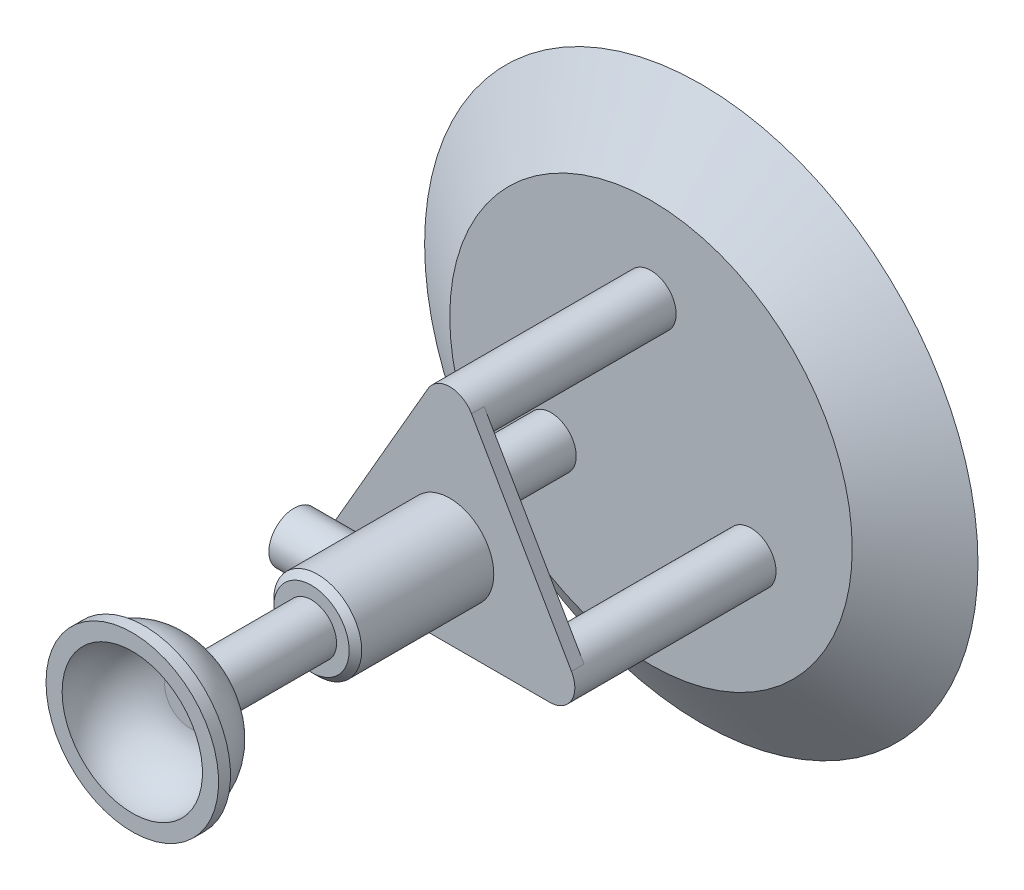
ISO-10303-21;
HEADER;
FILE_DESCRIPTION(('STEP AP214'),'2;1');
FILE_NAME('part.step','',(''),(''),'','','');
FILE_SCHEMA(('AUTOMOTIVE_DESIGN { 1 0 10303 214 1 1 1 1 }'));
ENDSEC;
DATA;
#1=APPLICATION_CONTEXT('core data for automotive mechanical design processes');
#2=APPLICATION_PROTOCOL_DEFINITION('international standard','automotive_design',2000,#1);
#3=PRODUCT_CONTEXT('',#1,'mechanical');
#4=PRODUCT('Part','Part','',(#3));
#5=PRODUCT_RELATED_PRODUCT_CATEGORY('part','',(#4));
#6=PRODUCT_DEFINITION_FORMATION('','',#4);
#7=PRODUCT_DEFINITION_CONTEXT('part definition',#1,'design');
#8=PRODUCT_DEFINITION('design','',#6,#7);
#9=PRODUCT_DEFINITION_SHAPE('','',#8);
#10=(LENGTH_UNIT() NAMED_UNIT(*) SI_UNIT(.MILLI.,.METRE.));
#11=(NAMED_UNIT(*) PLANE_ANGLE_UNIT() SI_UNIT($,.RADIAN.));
#12=(NAMED_UNIT(*) SI_UNIT($,.STERADIAN.) SOLID_ANGLE_UNIT());
#13=UNCERTAINTY_MEASURE_WITH_UNIT(LENGTH_MEASURE(1.E-05),#10,'distance_accuracy_value','');
#14=(GEOMETRIC_REPRESENTATION_CONTEXT(3) GLOBAL_UNCERTAINTY_ASSIGNED_CONTEXT((#13)) GLOBAL_UNIT_ASSIGNED_CONTEXT((#10,
#11,#12)) REPRESENTATION_CONTEXT('',''));
#15=CARTESIAN_POINT('',(0.,0.,0.));
#16=DIRECTION('',(0.,0.,1.));
#17=DIRECTION('',(1.,0.,0.));
#18=AXIS2_PLACEMENT_3D('',#15,#16,#17);
#19=CARTESIAN_POINT('',(0.,0.,0.));
#20=DIRECTION('',(0.,0.,1.));
#21=DIRECTION('',(1.,0.,0.));
#22=AXIS2_PLACEMENT_3D('',#19,#20,#21);
#23=PLANE('',#22);
#24=CARTESIAN_POINT('',(0.,0.,0.));
#25=DIRECTION('',(0.,0.,1.));
#26=DIRECTION('',(1.,0.,0.));
#27=AXIS2_PLACEMENT_3D('',#24,#25,#26);
#28=CIRCLE('',#27,22.);
#29=CARTESIAN_POINT('',(22.,0.,0.));
#30=VERTEX_POINT('',#29);
#31=EDGE_CURVE('E134',#30,#30,#28,.T.);
#32=ORIENTED_EDGE('',*,*,#31,.F.);
#33=EDGE_LOOP('',(#32));
#34=FACE_BOUND('',#33,.T.);
#35=ADVANCED_FACE('F41',(#34),#23,.F.);
#36=CARTESIAN_POINT('',(0.,0.,0.));
#37=DIRECTION('',(0.,0.,-1.));
#38=DIRECTION('',(-1.,0.,0.));
#39=AXIS2_PLACEMENT_3D('',#36,#37,#38);
#40=CONICAL_SURFACE('',#39,22.,0.982793723247328);
#41=CARTESIAN_POINT('',(0.,0.,4.));
#42=DIRECTION('',(0.,0.,1.));
#43=DIRECTION('',(1.,0.,0.));
#44=AXIS2_PLACEMENT_3D('',#41,#42,#43);
#45=CIRCLE('',#44,16.);
#46=CARTESIAN_POINT('',(16.,0.,4.));
#47=VERTEX_POINT('',#46);
#48=EDGE_CURVE('E131',#47,#47,#45,.T.);
#49=ORIENTED_EDGE('',*,*,#48,.F.);
#50=EDGE_LOOP('',(#49));
#51=FACE_BOUND('',#50,.T.);
#52=ORIENTED_EDGE('',*,*,#31,.T.);
#53=EDGE_LOOP('',(#52));
#54=FACE_BOUND('',#53,.T.);
#55=ADVANCED_FACE('F209',(#51,#54),#40,.T.);
#56=CARTESIAN_POINT('',(0.,16.,4.));
#57=DIRECTION('',(0.,0.,-1.));
#58=DIRECTION('',(-1.,0.,0.));
#59=AXIS2_PLACEMENT_3D('',#56,#57,#58);
#60=PLANE('',#59);
#61=CARTESIAN_POINT('',(0.,9.17346790913956,4.));
#62=DIRECTION('',(0.,0.,-1.));
#63=DIRECTION('',(-1.,0.,0.));
#64=AXIS2_PLACEMENT_3D('',#61,#62,#63);
#65=CIRCLE('',#64,2.);
#66=CARTESIAN_POINT('',(-2.,9.17346790913956,4.));
#67=VERTEX_POINT('',#66);
#68=EDGE_CURVE('E143',#67,#67,#65,.F.);
#69=ORIENTED_EDGE('',*,*,#68,.F.);
#70=EDGE_LOOP('',(#69));
#71=FACE_BOUND('',#70,.T.);
#72=CARTESIAN_POINT('',(-7.94445625011618,-4.58673395456978,4.));
#73=DIRECTION('',(0.,0.,-1.));
#74=DIRECTION('',(-1.,0.,0.));
#75=AXIS2_PLACEMENT_3D('',#72,#73,#74);
#76=CIRCLE('',#75,2.);
#77=CARTESIAN_POINT('',(-9.94445625011618,-4.58673395456978,4.));
#78=VERTEX_POINT('',#77);
#79=EDGE_CURVE('E140',#78,#78,#76,.F.);
#80=ORIENTED_EDGE('',*,*,#79,.F.);
#81=EDGE_LOOP('',(#80));
#82=FACE_BOUND('',#81,.T.);
#83=CARTESIAN_POINT('',(7.94445625011617,-4.58673395456978,4.));
#84=DIRECTION('',(0.,0.,-1.));
#85=DIRECTION('',(-1.,0.,0.));
#86=AXIS2_PLACEMENT_3D('',#83,#84,#85);
#87=CIRCLE('',#86,2.);
#88=CARTESIAN_POINT('',(5.94445625011617,-4.58673395456978,4.));
#89=VERTEX_POINT('',#88);
#90=EDGE_CURVE('E137',#89,#89,#87,.F.);
#91=ORIENTED_EDGE('',*,*,#90,.F.);
#92=EDGE_LOOP('',(#91));
#93=FACE_BOUND('',#92,.T.);
#94=ORIENTED_EDGE('',*,*,#48,.T.);
#95=EDGE_LOOP('',(#94));
#96=FACE_BOUND('',#95,.T.);
#97=ADVANCED_FACE('F214',(#71,#82,#93,#96),#60,.F.);
#98=CARTESIAN_POINT('',(7.94445625011617,-4.58673395456978,19.));
#99=DIRECTION('',(0.,0.,-1.));
#100=DIRECTION('',(-1.,0.,0.));
#101=AXIS2_PLACEMENT_3D('',#98,#99,#100);
#102=CYLINDRICAL_SURFACE('',#101,2.);
#103=CARTESIAN_POINT('',(7.94445625011617,-4.58673395456978,19.));
#104=DIRECTION('',(0.,0.,1.));
#105=DIRECTION('',(1.,0.,0.));
#106=AXIS2_PLACEMENT_3D('',#103,#104,#105);
#107=CIRCLE('',#106,2.);
#108=CARTESIAN_POINT('',(9.67650705768505,-3.58673395456978,19.));
#109=VERTEX_POINT('',#108);
#110=CARTESIAN_POINT('',(7.94445625011617,-6.58673395456978,19.));
#111=VERTEX_POINT('',#110);
#112=EDGE_CURVE('E63',#109,#111,#107,.T.);
#113=ORIENTED_EDGE('',*,*,#112,.F.);
#114=DIRECTION('',(0.,0.,-1.));
#115=VECTOR('',#114,1.);
#116=CARTESIAN_POINT('',(9.67650705768505,-3.58673395456978,20.));
#117=LINE('',#116,#115);
#118=CARTESIAN_POINT('',(9.67650705768505,-3.58673395456978,20.));
#119=VERTEX_POINT('',#118);
#120=EDGE_CURVE('E125',#119,#109,#117,.T.);
#121=ORIENTED_EDGE('',*,*,#120,.F.);
#122=CARTESIAN_POINT('',(7.94445625011617,-4.58673395456978,20.));
#123=DIRECTION('',(0.,0.,1.));
#124=DIRECTION('',(1.,0.,0.));
#125=AXIS2_PLACEMENT_3D('',#122,#123,#124);
#126=CIRCLE('',#125,2.);
#127=CARTESIAN_POINT('',(7.94445625011617,-6.58673395456978,20.));
#128=VERTEX_POINT('',#127);
#129=EDGE_CURVE('E110',#128,#119,#126,.T.);
#130=ORIENTED_EDGE('',*,*,#129,.F.);
#131=DIRECTION('',(0.,0.,-1.));
#132=VECTOR('',#131,1.);
#133=CARTESIAN_POINT('',(7.94445625011617,-6.58673395456978,20.));
#134=LINE('',#133,#132);
#135=EDGE_CURVE('E107',#128,#111,#134,.T.);
#136=ORIENTED_EDGE('',*,*,#135,.T.);
#137=EDGE_LOOP('',(#113,#121,#130,#136));
#138=FACE_BOUND('',#137,.T.);
#139=ORIENTED_EDGE('',*,*,#90,.T.);
#140=EDGE_LOOP('',(#139));
#141=FACE_BOUND('',#140,.T.);
#142=ADVANCED_FACE('F221',(#138,#141),#102,.T.);
#143=CARTESIAN_POINT('',(-7.94445625011618,-4.58673395456978,19.));
#144=DIRECTION('',(0.,0.,-1.));
#145=DIRECTION('',(-1.,0.,0.));
#146=AXIS2_PLACEMENT_3D('',#143,#144,#145);
#147=CYLINDRICAL_SURFACE('',#146,2.);
#148=CARTESIAN_POINT('',(-7.94445625011618,-4.58673395456978,19.));
#149=DIRECTION('',(0.,0.,1.));
#150=DIRECTION('',(1.,0.,0.));
#151=AXIS2_PLACEMENT_3D('',#148,#149,#150);
#152=CIRCLE('',#151,2.);
#153=CARTESIAN_POINT('',(-7.94445625011618,-6.58673395456978,19.));
#154=VERTEX_POINT('',#153);
#155=CARTESIAN_POINT('',(-9.67650705768505,-3.58673395456978,19.));
#156=VERTEX_POINT('',#155);
#157=EDGE_CURVE('E71',#154,#156,#152,.T.);
#158=ORIENTED_EDGE('',*,*,#157,.F.);
#159=DIRECTION('',(0.,0.,-1.));
#160=VECTOR('',#159,1.);
#161=CARTESIAN_POINT('',(-7.94445625011618,-6.58673395456978,20.));
#162=LINE('',#161,#160);
#163=CARTESIAN_POINT('',(-7.94445625011618,-6.58673395456978,20.));
#164=VERTEX_POINT('',#163);
#165=EDGE_CURVE('E105',#164,#154,#162,.T.);
#166=ORIENTED_EDGE('',*,*,#165,.F.);
#167=CARTESIAN_POINT('',(-7.94445625011618,-4.58673395456978,20.));
#168=DIRECTION('',(0.,0.,1.));
#169=DIRECTION('',(1.,0.,0.));
#170=AXIS2_PLACEMENT_3D('',#167,#168,#169);
#171=CIRCLE('',#170,2.);
#172=CARTESIAN_POINT('',(-9.67650705768505,-3.58673395456978,20.));
#173=VERTEX_POINT('',#172);
#174=EDGE_CURVE('E111',#173,#164,#171,.T.);
#175=ORIENTED_EDGE('',*,*,#174,.F.);
#176=DIRECTION('',(0.,0.,-1.));
#177=VECTOR('',#176,1.);
#178=CARTESIAN_POINT('',(-9.67650705768505,-3.58673395456978,20.));
#179=LINE('',#178,#177);
#180=EDGE_CURVE('E168',#173,#156,#179,.T.);
#181=ORIENTED_EDGE('',*,*,#180,.T.);
#182=EDGE_LOOP('',(#158,#166,#175,#181));
#183=FACE_BOUND('',#182,.T.);
#184=ORIENTED_EDGE('',*,*,#79,.T.);
#185=EDGE_LOOP('',(#184));
#186=FACE_BOUND('',#185,.T.);
#187=ADVANCED_FACE('F120',(#183,#186),#147,.T.);
#188=CARTESIAN_POINT('',(0.,9.17346790913956,19.));
#189=DIRECTION('',(0.,0.,-1.));
#190=DIRECTION('',(-1.,0.,0.));
#191=AXIS2_PLACEMENT_3D('',#188,#189,#190);
#192=CYLINDRICAL_SURFACE('',#191,2.);
#193=CARTESIAN_POINT('',(0.,9.17346790913956,19.));
#194=DIRECTION('',(0.,0.,1.));
#195=DIRECTION('',(1.,0.,0.));
#196=AXIS2_PLACEMENT_3D('',#193,#194,#195);
#197=CIRCLE('',#196,2.);
#198=CARTESIAN_POINT('',(-1.73205080756888,10.1734679091396,19.));
#199=VERTEX_POINT('',#198);
#200=CARTESIAN_POINT('',(1.73205080756888,10.1734679091396,19.));
#201=VERTEX_POINT('',#200);
#202=EDGE_CURVE('E123',#199,#201,#197,.T.);
#203=ORIENTED_EDGE('',*,*,#202,.F.);
#204=DIRECTION('',(0.,0.,-1.));
#205=VECTOR('',#204,1.);
#206=CARTESIAN_POINT('',(-1.73205080756888,10.1734679091396,20.));
#207=LINE('',#206,#205);
#208=CARTESIAN_POINT('',(-1.73205080756888,10.1734679091396,20.));
#209=VERTEX_POINT('',#208);
#210=EDGE_CURVE('E176',#209,#199,#207,.T.);
#211=ORIENTED_EDGE('',*,*,#210,.F.);
#212=CARTESIAN_POINT('',(0.,9.17346790913956,20.));
#213=DIRECTION('',(0.,0.,1.));
#214=DIRECTION('',(1.,0.,0.));
#215=AXIS2_PLACEMENT_3D('',#212,#213,#214);
#216=CIRCLE('',#215,2.);
#217=CARTESIAN_POINT('',(1.73205080756888,10.1734679091396,20.));
#218=VERTEX_POINT('',#217);
#219=EDGE_CURVE('E165',#218,#209,#216,.T.);
#220=ORIENTED_EDGE('',*,*,#219,.F.);
#221=DIRECTION('',(0.,0.,-1.));
#222=VECTOR('',#221,1.);
#223=CARTESIAN_POINT('',(1.73205080756888,10.1734679091396,20.));
#224=LINE('',#223,#222);
#225=EDGE_CURVE('E179',#218,#201,#224,.T.);
#226=ORIENTED_EDGE('',*,*,#225,.T.);
#227=EDGE_LOOP('',(#203,#211,#220,#226));
#228=FACE_BOUND('',#227,.T.);
#229=ORIENTED_EDGE('',*,*,#68,.T.);
#230=EDGE_LOOP('',(#229));
#231=FACE_BOUND('',#230,.T.);
#232=ADVANCED_FACE('F192',(#228,#231),#192,.T.);
#233=CARTESIAN_POINT('',(-7.94445625011618,-4.58673395456978,19.));
#234=DIRECTION('',(0.,0.,1.));
#235=DIRECTION('',(1.,0.,0.));
#236=AXIS2_PLACEMENT_3D('',#233,#234,#235);
#237=PLANE('',#236);
#238=DIRECTION('',(-0.5,0.866025403784439,0.));
#239=VECTOR('',#238,1.);
#240=CARTESIAN_POINT('',(1.73205080756888,10.1734679091396,19.));
#241=LINE('',#240,#239);
#242=EDGE_CURVE('E170',#109,#201,#241,.T.);
#243=ORIENTED_EDGE('',*,*,#242,.F.);
#244=ORIENTED_EDGE('',*,*,#112,.T.);
#245=DIRECTION('',(1.,0.,0.));
#246=VECTOR('',#245,1.);
#247=CARTESIAN_POINT('',(7.94445625011617,-6.58673395456978,19.));
#248=LINE('',#247,#246);
#249=EDGE_CURVE('E160',#154,#111,#248,.T.);
#250=ORIENTED_EDGE('',*,*,#249,.F.);
#251=ORIENTED_EDGE('',*,*,#157,.T.);
#252=DIRECTION('',(-0.5,-0.866025403784438,0.));
#253=VECTOR('',#252,1.);
#254=CARTESIAN_POINT('',(-1.73205080756888,10.1734679091396,19.));
#255=LINE('',#254,#253);
#256=EDGE_CURVE('E118',#199,#156,#255,.T.);
#257=ORIENTED_EDGE('',*,*,#256,.F.);
#258=ORIENTED_EDGE('',*,*,#202,.T.);
#259=EDGE_LOOP('',(#243,#244,#250,#251,#257,#258));
#260=FACE_BOUND('',#259,.T.);
#261=ADVANCED_FACE('F188',(#260),#237,.F.);
#262=CARTESIAN_POINT('',(7.94445625011617,-6.58673395456978,20.));
#263=DIRECTION('',(0.,1.,0.));
#264=DIRECTION('',(-1.,0.,0.));
#265=AXIS2_PLACEMENT_3D('',#262,#263,#264);
#266=PLANE('',#265);
#267=ORIENTED_EDGE('',*,*,#249,.T.);
#268=ORIENTED_EDGE('',*,*,#135,.F.);
#269=DIRECTION('',(1.,0.,0.));
#270=VECTOR('',#269,1.);
#271=CARTESIAN_POINT('',(7.94445625011617,-6.58673395456978,20.));
#272=LINE('',#271,#270);
#273=EDGE_CURVE('E102',#164,#128,#272,.T.);
#274=ORIENTED_EDGE('',*,*,#273,.F.);
#275=ORIENTED_EDGE('',*,*,#165,.T.);
#276=EDGE_LOOP('',(#267,#268,#274,#275));
#277=FACE_BOUND('',#276,.T.);
#278=ADVANCED_FACE('F104',(#277),#266,.F.);
#279=CARTESIAN_POINT('',(1.73205080756888,10.1734679091396,20.));
#280=DIRECTION('',(-0.866025403784439,-0.5,0.));
#281=DIRECTION('',(0.5,-0.866025403784439,0.));
#282=AXIS2_PLACEMENT_3D('',#279,#280,#281);
#283=PLANE('',#282);
#284=ORIENTED_EDGE('',*,*,#242,.T.);
#285=ORIENTED_EDGE('',*,*,#225,.F.);
#286=DIRECTION('',(-0.5,0.866025403784439,0.));
#287=VECTOR('',#286,1.);
#288=CARTESIAN_POINT('',(1.73205080756888,10.1734679091396,20.));
#289=LINE('',#288,#287);
#290=EDGE_CURVE('E163',#119,#218,#289,.T.);
#291=ORIENTED_EDGE('',*,*,#290,.F.);
#292=ORIENTED_EDGE('',*,*,#120,.T.);
#293=EDGE_LOOP('',(#284,#285,#291,#292));
#294=FACE_BOUND('',#293,.T.);
#295=ADVANCED_FACE('F185',(#294),#283,.F.);
#296=CARTESIAN_POINT('',(-1.73205080756888,10.1734679091396,20.));
#297=DIRECTION('',(0.866025403784439,-0.5,0.));
#298=DIRECTION('',(0.5,0.866025403784438,0.));
#299=AXIS2_PLACEMENT_3D('',#296,#297,#298);
#300=PLANE('',#299);
#301=ORIENTED_EDGE('',*,*,#256,.T.);
#302=ORIENTED_EDGE('',*,*,#180,.F.);
#303=DIRECTION('',(-0.5,-0.866025403784438,0.));
#304=VECTOR('',#303,1.);
#305=CARTESIAN_POINT('',(-1.73205080756888,10.1734679091396,20.));
#306=LINE('',#305,#304);
#307=EDGE_CURVE('E116',#209,#173,#306,.T.);
#308=ORIENTED_EDGE('',*,*,#307,.F.);
#309=ORIENTED_EDGE('',*,*,#210,.T.);
#310=EDGE_LOOP('',(#301,#302,#308,#309));
#311=FACE_BOUND('',#310,.T.);
#312=ADVANCED_FACE('F196',(#311),#300,.F.);
#313=CARTESIAN_POINT('',(-7.94445625011618,-4.58673395456978,20.));
#314=DIRECTION('',(0.,0.,1.));
#315=DIRECTION('',(1.,0.,0.));
#316=AXIS2_PLACEMENT_3D('',#313,#314,#315);
#317=PLANE('',#316);
#318=CARTESIAN_POINT('',(0.,0.,20.));
#319=DIRECTION('',(0.,0.,1.));
#320=DIRECTION('',(1.,0.,0.));
#321=AXIS2_PLACEMENT_3D('',#318,#319,#320);
#322=CIRCLE('',#321,3.5);
#323=CARTESIAN_POINT('',(3.5,0.,20.));
#324=VERTEX_POINT('',#323);
#325=EDGE_CURVE('E158',#324,#324,#322,.T.);
#326=ORIENTED_EDGE('',*,*,#325,.F.);
#327=EDGE_LOOP('',(#326));
#328=FACE_BOUND('',#327,.T.);
#329=ORIENTED_EDGE('',*,*,#174,.T.);
#330=ORIENTED_EDGE('',*,*,#273,.T.);
#331=ORIENTED_EDGE('',*,*,#129,.T.);
#332=ORIENTED_EDGE('',*,*,#290,.T.);
#333=ORIENTED_EDGE('',*,*,#219,.T.);
#334=ORIENTED_EDGE('',*,*,#307,.T.);
#335=EDGE_LOOP('',(#329,#330,#331,#332,#333,#334));
#336=FACE_BOUND('',#335,.T.);
#337=ADVANCED_FACE('F114',(#328,#336),#317,.T.);
#338=CARTESIAN_POINT('',(0.,0.,31.));
#339=DIRECTION('',(0.,0.,-1.));
#340=DIRECTION('',(-1.,0.,0.));
#341=AXIS2_PLACEMENT_3D('',#338,#339,#340);
#342=CYLINDRICAL_SURFACE('',#341,3.5);
#343=CARTESIAN_POINT('',(-3.5,0.,27.3820843778974));
#344=CARTESIAN_POINT('',(-3.49999553497163,-0.103121073276095,27.3820794051495));
#345=CARTESIAN_POINT('',(-3.49539218804252,-0.206418292241572,27.3740538315829));
#346=CARTESIAN_POINT('',(-3.47741964792396,-0.409938220573779,27.3423427601928));
#347=CARTESIAN_POINT('',(-3.46402785992758,-0.510152306170787,27.318616896097));
#348=CARTESIAN_POINT('',(-3.42984640883029,-0.70413669278199,27.2567855799629));
#349=CARTESIAN_POINT('',(-3.40909195395481,-0.797935169936747,27.2187485124475));
#350=CARTESIAN_POINT('',(-3.36199330055898,-0.977566018148807,27.1297745122004));
#351=CARTESIAN_POINT('',(-3.33565065986803,-1.06340059975112,27.0788411738229));
#352=CARTESIAN_POINT('',(-3.27741428654612,-1.23168334606476,26.9613985804445));
#353=CARTESIAN_POINT('',(-3.24525701136939,-1.31343890348909,26.8940299047975));
#354=CARTESIAN_POINT('',(-3.17964476042357,-1.46516457042853,26.7475270360337));
#355=CARTESIAN_POINT('',(-3.1461882973923,-1.53512065191323,26.6683790462737));
#356=CARTESIAN_POINT('',(-3.07747838735578,-1.66894420512512,26.4903879586677));
#357=CARTESIAN_POINT('',(-3.04242478885631,-1.73132377325174,26.3903392500471));
#358=CARTESIAN_POINT('',(-2.9791301999857,-1.83811251873574,26.1791341058019));
#359=CARTESIAN_POINT('',(-2.9508789226201,-1.88254890095162,26.0679948068881));
#360=CARTESIAN_POINT('',(-2.9109223878371,-1.94359344806483,25.8629392135452));
#361=CARTESIAN_POINT('',(-2.89693925602986,-1.96418339921187,25.7706528637225));
#362=CARTESIAN_POINT('',(-2.87781339076578,-1.99210676207498,25.5832346422041));
#363=CARTESIAN_POINT('',(-2.87266118113285,-1.99945438414142,25.4881059322604));
#364=CARTESIAN_POINT('',(-2.87194187276704,-2.00048758468052,25.2976096925887));
#365=CARTESIAN_POINT('',(-2.87638786414303,-1.99415450528781,25.2022420141109));
#366=CARTESIAN_POINT('',(-2.89422946937727,-1.96816496378147,25.0141818727107));
#367=CARTESIAN_POINT('',(-2.90763124084925,-1.94849933463808,24.9214912962245));
#368=CARTESIAN_POINT('',(-2.94153701353578,-1.8969175277205,24.741419447578));
#369=CARTESIAN_POINT('',(-2.9620133688412,-1.86504898450024,24.6540190423984));
#370=CARTESIAN_POINT('',(-3.00785886649625,-1.79016995537344,24.4855345252197));
#371=CARTESIAN_POINT('',(-3.03322987990244,-1.74715520649775,24.4044528453422));
#372=CARTESIAN_POINT('',(-3.09092813712121,-1.64323768381765,24.2371114825277));
#373=CARTESIAN_POINT('',(-3.12371858601075,-1.5805729697491,24.1521042361693));
#374=CARTESIAN_POINT('',(-3.18971935679179,-1.44275323922578,23.993000058396));
#375=CARTESIAN_POINT('',(-3.22293001410094,-1.3675875758611,23.9189125295055));
#376=CARTESIAN_POINT('',(-3.29050445602272,-1.19664071603844,23.775260176484));
#377=CARTESIAN_POINT('',(-3.32456879734034,-1.0994865853507,23.7071714267794));
#378=CARTESIAN_POINT('',(-3.38586602556589,-0.893015490655648,23.5885775864423));
#379=CARTESIAN_POINT('',(-3.41310321475137,-0.783706249477135,23.538061414246));
#380=CARTESIAN_POINT('',(-3.45598032097163,-0.563793778179168,23.4599004536715));
#381=CARTESIAN_POINT('',(-3.47229170031822,-0.453802193453646,23.4309161672822));
#382=CARTESIAN_POINT('',(-3.49427902499676,-0.229493069556976,23.3920462190186));
#383=CARTESIAN_POINT('',(-3.49996545850225,-0.115179910205493,23.382141722664));
#384=CARTESIAN_POINT('',(-3.50003013582766,0.0995234593134453,23.3820343667636));
#385=CARTESIAN_POINT('',(-3.49569611836472,0.199920938989513,23.3895879117131));
#386=CARTESIAN_POINT('',(-3.47874174583056,0.397754958971081,23.4194849512925));
#387=CARTESIAN_POINT('',(-3.46612124870397,0.495191448486276,23.4418286994713));
#388=CARTESIAN_POINT('',(-3.43391644887745,0.683570804723375,23.4999690163645));
#389=CARTESIAN_POINT('',(-3.41440488141579,0.774570013012139,23.5356252878384));
#390=CARTESIAN_POINT('',(-3.36999496877882,0.949355356164682,23.6191001139445));
#391=CARTESIAN_POINT('',(-3.34509532684397,1.03313974782513,23.666921596892));
#392=CARTESIAN_POINT('',(-3.28897467991618,1.20050997117732,23.7789782187553));
#393=CARTESIAN_POINT('',(-3.25736546620182,1.28316737085611,23.8444037160601));
#394=CARTESIAN_POINT('',(-3.19250590835506,1.43697220197863,23.9870460390202));
#395=CARTESIAN_POINT('',(-3.15925371640031,1.50810627029584,24.0642763554384));
#396=CARTESIAN_POINT('',(-3.09042173562361,1.64492727997191,24.2384869017062));
#397=CARTESIAN_POINT('',(-3.05499597284182,1.70912186715334,24.3367091764896));
#398=CARTESIAN_POINT('',(-2.99031347421968,1.8199337629672,24.5444390093128));
#399=CARTESIAN_POINT('',(-2.96104856289278,1.86657443137411,24.6539313207949));
#400=CARTESIAN_POINT('',(-2.91851233429598,1.93222109228879,24.8573196419061));
#401=CARTESIAN_POINT('',(-2.90316105554951,1.95499953445203,24.9495608689292));
#402=CARTESIAN_POINT('',(-2.88119032331328,1.98724336712396,25.1373184702407));
#403=CARTESIAN_POINT('',(-2.87456093476639,1.99672390601701,25.2328309906932));
#404=CARTESIAN_POINT('',(-2.87099312033822,2.00185191685028,25.4246071477643));
#405=CARTESIAN_POINT('',(-2.87407420528575,1.99747153858607,25.5208719084432));
#406=CARTESIAN_POINT('',(-2.8895014010665,1.97508383758896,25.7110615285898));
#407=CARTESIAN_POINT('',(-2.90185337180125,1.95706789608754,25.8049848692915));
#408=CARTESIAN_POINT('',(-2.93383807739166,1.90877044170586,25.986460010931));
#409=CARTESIAN_POINT('',(-2.95334114102881,1.87870654392502,26.0740939361466));
#410=CARTESIAN_POINT('',(-2.99749553285304,1.8074218972167,26.243283473641));
#411=CARTESIAN_POINT('',(-3.02214875873851,1.7661970341072,26.324836830319));
#412=CARTESIAN_POINT('',(-3.07843523089261,1.66643167949608,26.4929277108405));
#413=CARTESIAN_POINT('',(-3.11055873295866,1.60620233461966,26.5782989583562));
#414=CARTESIAN_POINT('',(-3.17562734730331,1.47338604433881,26.7385420116194));
#415=CARTESIAN_POINT('',(-3.20857315102009,1.40078837818173,26.8134046050015));
#416=CARTESIAN_POINT('',(-3.27641810201075,1.23454792336606,26.9599451010183));
#417=CARTESIAN_POINT('',(-3.3110499554466,1.13941038595581,27.0300667601003));
#418=CARTESIAN_POINT('',(-3.37399623220539,0.936681498761433,27.1531431665286));
#419=CARTESIAN_POINT('',(-3.4023141898287,0.829097167751349,27.2061075254959));
#420=CARTESIAN_POINT('',(-3.44515268687731,0.624382501194143,27.2847015220303));
#421=CARTESIAN_POINT('',(-3.46123111271098,0.528793868969377,27.3135167288796));
#422=CARTESIAN_POINT('',(-3.48544612424225,0.333572465521439,27.3565865609773));
#423=CARTESIAN_POINT('',(-3.49360564902775,0.233952251382025,27.3708832483806));
#424=CARTESIAN_POINT('',(-3.49829363663156,0.111553482810452,27.3790965543192));
#425=CARTESIAN_POINT('',(-3.49893257713488,0.0892655426398918,27.3802159080223));
#426=CARTESIAN_POINT('',(-3.49978626453079,0.0446544907867988,27.3817103972835));
#427=CARTESIAN_POINT('',(-3.50000096692386,0.0223313756604217,27.3820854547704));
#428=CARTESIAN_POINT('',(-3.5,0.,27.3820843778974));
#429=B_SPLINE_CURVE_WITH_KNOTS('',3,(#343,#344,#345,#346,#347,#348,#349,#350,#351,#352,#353,
#354,#355,#356,#357,#358,#359,#360,#361,#362,#363,#364,#365,#366,#367,#368,#369,#370,#371,#372,
#373,#374,#375,#376,#377,#378,#379,#380,#381,#382,#383,#384,#385,#386,#387,#388,#389,#390,#391,
#392,#393,#394,#395,#396,#397,#398,#399,#400,#401,#402,#403,#404,#405,#406,#407,#408,#409,#410,
#411,#412,#413,#414,#415,#416,#417,#418,#419,#420,#421,#422,#423,#424,#425,#426,#427,#428),
.UNSPECIFIED.,.T.,.F.,(4,2,2,2,2,2,2,2,2,2,2,2,2,2,2,2,2,2,2,2,2,2,2,2,2,2,2,2,2,2,2,2,2,2,2,2,
2,2,2,2,2,2,4),(0.,0.309268603260587,0.61933545790836,0.927939130491697,1.23645688582088,
1.56726264134176,1.89845895106408,2.2656484043951,2.63227902790326,2.91779157032785,
3.2029975462506,3.48859273422686,3.77438448762791,4.05907183070885,4.34386821620899,
4.67430361887065,5.00502190433096,5.37340568410987,5.74155673192309,6.08426181113763,
6.42662841774189,6.72747548140296,7.028327702629,7.32609492686909,7.62393389525625,
7.95277463151787,8.28199402221958,8.64793130772769,9.01337988790353,9.30087929443284,
9.58805092761004,9.87579992974731,10.1637309643623,10.4466801504154,10.7297337802306,
11.0563737137124,11.3832982298873,11.7509152703937,12.1183260120783,12.4204193511693,
12.7216349655948,12.7886015789519,12.85557521625),.UNSPECIFIED.);
#430=CARTESIAN_POINT('',(-3.5,0.,27.3820843778974));
#431=VERTEX_POINT('',#430);
#432=EDGE_CURVE('E46',#431,#431,#429,.T.);
#433=ORIENTED_EDGE('',*,*,#432,.T.);
#434=EDGE_LOOP('',(#433));
#435=FACE_BOUND('',#434,.T.);
#436=CARTESIAN_POINT('',(0.,0.,30.5));
#437=DIRECTION('',(0.,0.,1.));
#438=DIRECTION('',(1.,0.,0.));
#439=AXIS2_PLACEMENT_3D('',#436,#437,#438);
#440=CIRCLE('',#439,3.5);
#441=CARTESIAN_POINT('',(3.5,0.,30.5));
#442=VERTEX_POINT('',#441);
#443=EDGE_CURVE('E11',#442,#442,#440,.F.);
#444=ORIENTED_EDGE('',*,*,#443,.T.);
#445=EDGE_LOOP('',(#444));
#446=FACE_BOUND('',#445,.T.);
#447=ORIENTED_EDGE('',*,*,#325,.T.);
#448=EDGE_LOOP('',(#447));
#449=FACE_BOUND('',#448,.T.);
#450=ADVANCED_FACE('F203',(#435,#446,#449),#342,.T.);
#451=CARTESIAN_POINT('',(0.,0.,31.));
#452=DIRECTION('',(0.,0.,1.));
#453=DIRECTION('',(1.,0.,0.));
#454=AXIS2_PLACEMENT_3D('',#451,#452,#453);
#455=PLANE('',#454);
#456=CARTESIAN_POINT('',(0.,0.,31.));
#457=DIRECTION('',(0.,0.,1.));
#458=DIRECTION('',(1.,0.,0.));
#459=AXIS2_PLACEMENT_3D('',#456,#457,#458);
#460=CIRCLE('',#459,3.00000000000002);
#461=CARTESIAN_POINT('',(3.00000000000002,0.,31.));
#462=VERTEX_POINT('',#461);
#463=EDGE_CURVE('E56',#462,#462,#460,.T.);
#464=ORIENTED_EDGE('',*,*,#463,.T.);
#465=EDGE_LOOP('',(#464));
#466=FACE_BOUND('',#465,.T.);
#467=CARTESIAN_POINT('',(0.,0.,31.));
#468=DIRECTION('',(0.,0.,1.));
#469=DIRECTION('',(1.,0.,0.));
#470=AXIS2_PLACEMENT_3D('',#467,#468,#469);
#471=CIRCLE('',#470,2.);
#472=CARTESIAN_POINT('',(2.,0.,31.));
#473=VERTEX_POINT('',#472);
#474=EDGE_CURVE('E146',#473,#473,#471,.T.);
#475=ORIENTED_EDGE('',*,*,#474,.F.);
#476=EDGE_LOOP('',(#475));
#477=FACE_BOUND('',#476,.T.);
#478=ADVANCED_FACE('F238',(#466,#477),#455,.T.);
#479=CARTESIAN_POINT('',(0.,0.,40.));
#480=DIRECTION('',(0.,0.,-1.));
#481=DIRECTION('',(-1.,0.,0.));
#482=AXIS2_PLACEMENT_3D('',#479,#480,#481);
#483=CYLINDRICAL_SURFACE('',#482,2.);
#484=CARTESIAN_POINT('',(0.,0.,40.));
#485=DIRECTION('',(0.,0.,1.));
#486=DIRECTION('',(1.,0.,0.));
#487=AXIS2_PLACEMENT_3D('',#484,#485,#486);
#488=CIRCLE('',#487,2.);
#489=CARTESIAN_POINT('',(2.,0.,40.));
#490=VERTEX_POINT('',#489);
#491=EDGE_CURVE('E156',#490,#490,#488,.T.);
#492=ORIENTED_EDGE('',*,*,#491,.F.);
#493=EDGE_LOOP('',(#492));
#494=FACE_BOUND('',#493,.T.);
#495=ORIENTED_EDGE('',*,*,#474,.T.);
#496=EDGE_LOOP('',(#495));
#497=FACE_BOUND('',#496,.T.);
#498=ADVANCED_FACE('F242',(#494,#497),#483,.T.);
#499=CARTESIAN_POINT('',(0.,0.,31.));
#500=DIRECTION('',(0.,0.,-1.));
#501=DIRECTION('',(-1.,0.,0.));
#502=AXIS2_PLACEMENT_3D('',#499,#500,#501);
#503=CONICAL_SURFACE('',#502,3.00000000000002,0.785398163397445);
#504=ORIENTED_EDGE('',*,*,#443,.F.);
#505=EDGE_LOOP('',(#504));
#506=FACE_BOUND('',#505,.T.);
#507=ORIENTED_EDGE('',*,*,#463,.F.);
#508=EDGE_LOOP('',(#507));
#509=FACE_BOUND('',#508,.T.);
#510=ADVANCED_FACE('F44',(#506,#509),#503,.T.);
#511=CARTESIAN_POINT('',(0.,0.,40.6674968703934));
#512=DIRECTION('',(0.,0.,-1.));
#513=DIRECTION('',(-1.,0.,0.));
#514=AXIS2_PLACEMENT_3D('',#511,#512,#513);
#515=PLANE('',#514);
#516=CARTESIAN_POINT('',(0.,0.,40.6674968703934));
#517=DIRECTION('',(0.,0.,-1.));
#518=DIRECTION('',(-1.,0.,0.));
#519=AXIS2_PLACEMENT_3D('',#516,#517,#518);
#520=CIRCLE('',#519,2.);
#521=CARTESIAN_POINT('',(-2.,0.,40.6674968703934));
#522=VERTEX_POINT('',#521);
#523=EDGE_CURVE('E296',#522,#522,#520,.T.);
#524=ORIENTED_EDGE('',*,*,#523,.F.);
#525=EDGE_LOOP('',(#524));
#526=FACE_BOUND('',#525,.T.);
#527=ADVANCED_FACE('F246',(#526),#515,.F.);
#528=CARTESIAN_POINT('',(0.,0.,44.7437241718936));
#529=DIRECTION('',(0.,0.,-1.));
#530=DIRECTION('',(-1.,0.,0.));
#531=AXIS2_PLACEMENT_3D('',#528,#529,#530);
#532=DEGENERATE_TOROIDAL_SURFACE('',#531,1.50204445839013,4.10653001144703,.T.);
#533=CARTESIAN_POINT('',(0.,0.,45.2416797135034));
#534=DIRECTION('',(0.,0.,-1.));
#535=DIRECTION('',(-1.,0.,0.));
#536=AXIS2_PLACEMENT_3D('',#533,#534,#535);
#537=CIRCLE('',#536,5.57827175989027);
#538=CARTESIAN_POINT('',(-5.57827175989027,0.,45.2416797135034));
#539=VERTEX_POINT('',#538);
#540=EDGE_CURVE('E294',#539,#539,#537,.T.);
#541=ORIENTED_EDGE('',*,*,#540,.F.);
#542=EDGE_LOOP('',(#541));
#543=FACE_BOUND('',#542,.T.);
#544=ORIENTED_EDGE('',*,*,#523,.T.);
#545=EDGE_LOOP('',(#544));
#546=FACE_BOUND('',#545,.T.);
#547=ADVANCED_FACE('F249',(#543,#546),#532,.F.);
#548=CARTESIAN_POINT('',(6.86127426466503,0.,45.2416797135034));
#549=DIRECTION('',(0.,0.,-1.));
#550=DIRECTION('',(-1.,0.,0.));
#551=AXIS2_PLACEMENT_3D('',#548,#549,#550);
#552=PLANE('',#551);
#553=CARTESIAN_POINT('',(0.,0.,45.2416797135034));
#554=DIRECTION('',(0.,0.,-1.));
#555=DIRECTION('',(-1.,0.,0.));
#556=AXIS2_PLACEMENT_3D('',#553,#554,#555);
#557=CIRCLE('',#556,6.86127426466503);
#558=CARTESIAN_POINT('',(-6.86127426466503,0.,45.2416797135034));
#559=VERTEX_POINT('',#558);
#560=EDGE_CURVE('E291',#559,#559,#557,.T.);
#561=ORIENTED_EDGE('',*,*,#560,.F.);
#562=EDGE_LOOP('',(#561));
#563=FACE_BOUND('',#562,.T.);
#564=ORIENTED_EDGE('',*,*,#540,.T.);
#565=EDGE_LOOP('',(#564));
#566=FACE_BOUND('',#565,.T.);
#567=ADVANCED_FACE('F253',(#563,#566),#552,.F.);
#568=CARTESIAN_POINT('',(0.,0.,40.));
#569=DIRECTION('',(0.,0.,-1.));
#570=DIRECTION('',(-1.,0.,0.));
#571=AXIS2_PLACEMENT_3D('',#568,#569,#570);
#572=CYLINDRICAL_SURFACE('',#571,6.86127426466503);
#573=CARTESIAN_POINT('',(0.,0.,44.2933735143221));
#574=DIRECTION('',(0.,0.,-1.));
#575=DIRECTION('',(-1.,0.,0.));
#576=AXIS2_PLACEMENT_3D('',#573,#574,#575);
#577=CIRCLE('',#576,6.86127426466503);
#578=CARTESIAN_POINT('',(-6.86127426466503,0.,44.2933735143221));
#579=VERTEX_POINT('',#578);
#580=EDGE_CURVE('E288',#579,#579,#577,.T.);
#581=ORIENTED_EDGE('',*,*,#580,.F.);
#582=EDGE_LOOP('',(#581));
#583=FACE_BOUND('',#582,.T.);
#584=ORIENTED_EDGE('',*,*,#560,.T.);
#585=EDGE_LOOP('',(#584));
#586=FACE_BOUND('',#585,.T.);
#587=ADVANCED_FACE('F257',(#583,#586),#572,.T.);
#588=CARTESIAN_POINT('',(6.1918816534782,0.,44.2933735143221));
#589=DIRECTION('',(0.,0.,1.));
#590=DIRECTION('',(1.,0.,0.));
#591=AXIS2_PLACEMENT_3D('',#588,#589,#590);
#592=PLANE('',#591);
#593=CARTESIAN_POINT('',(0.,0.,44.2933735143221));
#594=DIRECTION('',(0.,0.,-1.));
#595=DIRECTION('',(-1.,0.,0.));
#596=AXIS2_PLACEMENT_3D('',#593,#594,#595);
#597=CIRCLE('',#596,6.1918816534782);
#598=CARTESIAN_POINT('',(-6.1918816534782,0.,44.2933735143221));
#599=VERTEX_POINT('',#598);
#600=EDGE_CURVE('E284',#599,#599,#597,.T.);
#601=ORIENTED_EDGE('',*,*,#600,.F.);
#602=EDGE_LOOP('',(#601));
#603=FACE_BOUND('',#602,.T.);
#604=ORIENTED_EDGE('',*,*,#580,.T.);
#605=EDGE_LOOP('',(#604));
#606=FACE_BOUND('',#605,.T.);
#607=ADVANCED_FACE('F261',(#603,#606),#592,.F.);
#608=CARTESIAN_POINT('',(0.,0.,44.2426275839006));
#609=DIRECTION('',(0.,0.,-1.));
#610=DIRECTION('',(-1.,0.,0.));
#611=AXIS2_PLACEMENT_3D('',#608,#609,#610);
#612=DEGENERATE_TOROIDAL_SURFACE('',#611,1.94925406957763,4.24293105825776,.T.);
#613=ORIENTED_EDGE('',*,*,#491,.T.);
#614=EDGE_LOOP('',(#613));
#615=FACE_BOUND('',#614,.T.);
#616=ORIENTED_EDGE('',*,*,#600,.T.);
#617=EDGE_LOOP('',(#616));
#618=FACE_BOUND('',#617,.T.);
#619=ADVANCED_FACE('F265',(#615,#618),#612,.T.);
#620=CARTESIAN_POINT('',(-7.,0.,25.3820843778974));
#621=DIRECTION('',(1.,0.,0.));
#622=DIRECTION('',(0.,0.,-1.));
#623=AXIS2_PLACEMENT_3D('',#620,#621,#622);
#624=CYLINDRICAL_SURFACE('',#623,2.);
#625=CARTESIAN_POINT('',(-7.,0.,25.3820843778974));
#626=DIRECTION('',(1.,0.,0.));
#627=DIRECTION('',(0.,0.,-1.));
#628=AXIS2_PLACEMENT_3D('',#625,#626,#627);
#629=CIRCLE('',#628,2.);
#630=CARTESIAN_POINT('',(-7.,0.,23.3820843778974));
#631=VERTEX_POINT('',#630);
#632=EDGE_CURVE('E281',#631,#631,#629,.T.);
#633=ORIENTED_EDGE('',*,*,#632,.T.);
#634=EDGE_LOOP('',(#633));
#635=FACE_BOUND('',#634,.T.);
#636=ORIENTED_EDGE('',*,*,#432,.F.);
#637=EDGE_LOOP('',(#636));
#638=FACE_BOUND('',#637,.T.);
#639=ADVANCED_FACE('F268',(#635,#638),#624,.T.);
#640=CARTESIAN_POINT('',(-7.,0.,25.3820843778974));
#641=DIRECTION('',(1.,0.,0.));
#642=DIRECTION('',(0.,0.,-1.));
#643=AXIS2_PLACEMENT_3D('',#640,#641,#642);
#644=PLANE('',#643);
#645=ORIENTED_EDGE('',*,*,#632,.F.);
#646=EDGE_LOOP('',(#645));
#647=FACE_BOUND('',#646,.T.);
#648=ADVANCED_FACE('F273',(#647),#644,.F.);
#649=CLOSED_SHELL('',(#35,#55,#97,#142,#187,#232,#261,#278,#295,#312,#337,#450,#478,#498,#510,
#527,#547,#567,#587,#607,#619,#639,#648));
#650=MANIFOLD_SOLID_BREP('B2',#649);
#651=ADVANCED_BREP_SHAPE_REPRESENTATION('',(#18,#650),#14);
#652=SHAPE_DEFINITION_REPRESENTATION(#9,#651);
ENDSEC;
END-ISO-10303-21;
